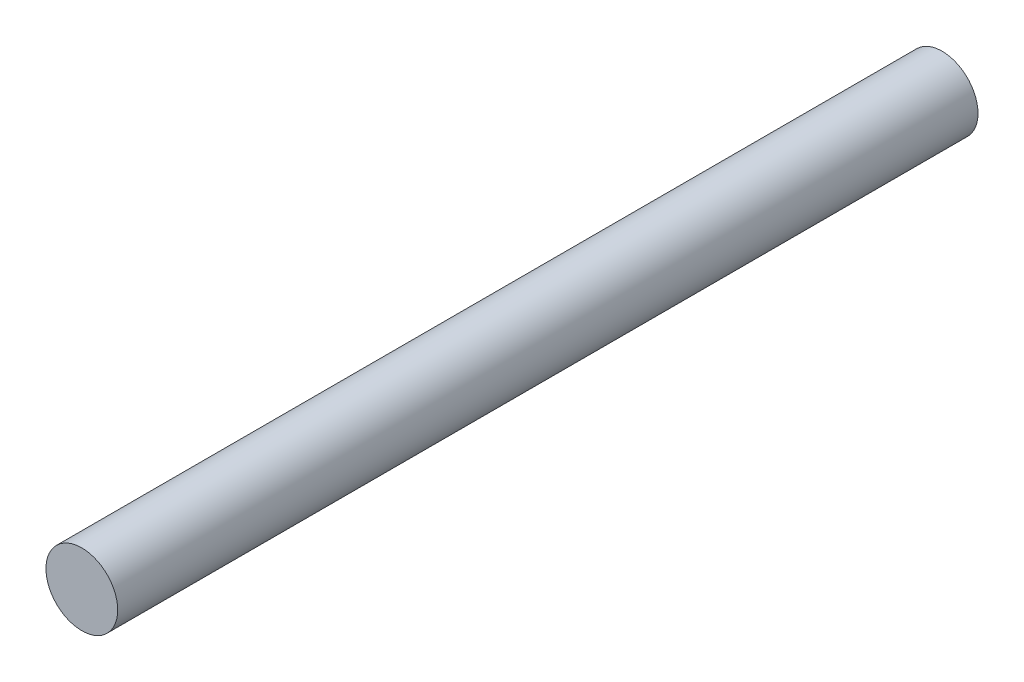
ISO-10303-21;
HEADER;
FILE_DESCRIPTION(('STEP AP214'),'2;1');
FILE_NAME('part.step','',(''),(''),'','','');
FILE_SCHEMA(('AUTOMOTIVE_DESIGN { 1 0 10303 214 1 1 1 1 }'));
ENDSEC;
DATA;
#1=APPLICATION_CONTEXT('core data for automotive mechanical design processes');
#2=APPLICATION_PROTOCOL_DEFINITION('international standard','automotive_design',2000,#1);
#3=PRODUCT_CONTEXT('',#1,'mechanical');
#4=PRODUCT('Part','Part','',(#3));
#5=PRODUCT_RELATED_PRODUCT_CATEGORY('part','',(#4));
#6=PRODUCT_DEFINITION_FORMATION('','',#4);
#7=PRODUCT_DEFINITION_CONTEXT('part definition',#1,'design');
#8=PRODUCT_DEFINITION('design','',#6,#7);
#9=PRODUCT_DEFINITION_SHAPE('','',#8);
#10=(LENGTH_UNIT() NAMED_UNIT(*) SI_UNIT(.MILLI.,.METRE.));
#11=(NAMED_UNIT(*) PLANE_ANGLE_UNIT() SI_UNIT($,.RADIAN.));
#12=(NAMED_UNIT(*) SI_UNIT($,.STERADIAN.) SOLID_ANGLE_UNIT());
#13=UNCERTAINTY_MEASURE_WITH_UNIT(LENGTH_MEASURE(1.E-05),#10,'distance_accuracy_value','');
#14=(GEOMETRIC_REPRESENTATION_CONTEXT(3) GLOBAL_UNCERTAINTY_ASSIGNED_CONTEXT((#13)) GLOBAL_UNIT_ASSIGNED_CONTEXT((#10,
#11,#12)) REPRESENTATION_CONTEXT('',''));
#15=CARTESIAN_POINT('',(0.,0.,0.));
#16=DIRECTION('',(0.,0.,1.));
#17=DIRECTION('',(1.,0.,0.));
#18=AXIS2_PLACEMENT_3D('',#15,#16,#17);
#19=CARTESIAN_POINT('',(0.,0.,38.));
#20=DIRECTION('',(0.,0.,-1.));
#21=DIRECTION('',(-1.,0.,0.));
#22=AXIS2_PLACEMENT_3D('',#19,#20,#21);
#23=CYLINDRICAL_SURFACE('',#22,1.585);
#24=CARTESIAN_POINT('',(0.,0.,38.));
#25=DIRECTION('',(0.,0.,1.));
#26=DIRECTION('',(1.,0.,0.));
#27=AXIS2_PLACEMENT_3D('',#24,#25,#26);
#28=CIRCLE('',#27,1.585);
#29=CARTESIAN_POINT('',(1.585,0.,38.));
#30=VERTEX_POINT('',#29);
#31=EDGE_CURVE('E10',#30,#30,#28,.T.);
#32=ORIENTED_EDGE('',*,*,#31,.F.);
#33=EDGE_LOOP('',(#32));
#34=FACE_BOUND('',#33,.T.);
#35=CARTESIAN_POINT('',(0.,0.,0.));
#36=DIRECTION('',(0.,0.,1.));
#37=DIRECTION('',(1.,0.,0.));
#38=AXIS2_PLACEMENT_3D('',#35,#36,#37);
#39=CIRCLE('',#38,1.585);
#40=CARTESIAN_POINT('',(1.585,0.,0.));
#41=VERTEX_POINT('',#40);
#42=EDGE_CURVE('E34',#41,#41,#39,.T.);
#43=ORIENTED_EDGE('',*,*,#42,.T.);
#44=EDGE_LOOP('',(#43));
#45=FACE_BOUND('',#44,.T.);
#46=ADVANCED_FACE('F31',(#34,#45),#23,.T.);
#47=CARTESIAN_POINT('',(0.,0.,38.));
#48=DIRECTION('',(0.,0.,1.));
#49=DIRECTION('',(1.,0.,0.));
#50=AXIS2_PLACEMENT_3D('',#47,#48,#49);
#51=PLANE('',#50);
#52=ORIENTED_EDGE('',*,*,#31,.T.);
#53=EDGE_LOOP('',(#52));
#54=FACE_BOUND('',#53,.T.);
#55=ADVANCED_FACE('F46',(#54),#51,.T.);
#56=CARTESIAN_POINT('',(0.,0.,0.));
#57=DIRECTION('',(0.,0.,1.));
#58=DIRECTION('',(1.,0.,0.));
#59=AXIS2_PLACEMENT_3D('',#56,#57,#58);
#60=PLANE('',#59);
#61=ORIENTED_EDGE('',*,*,#42,.F.);
#62=EDGE_LOOP('',(#61));
#63=FACE_BOUND('',#62,.T.);
#64=ADVANCED_FACE('F44',(#63),#60,.F.);
#65=CLOSED_SHELL('',(#46,#55,#64));
#66=MANIFOLD_SOLID_BREP('B2',#65);
#67=ADVANCED_BREP_SHAPE_REPRESENTATION('',(#18,#66),#14);
#68=SHAPE_DEFINITION_REPRESENTATION(#9,#67);
ENDSEC;
END-ISO-10303-21;
